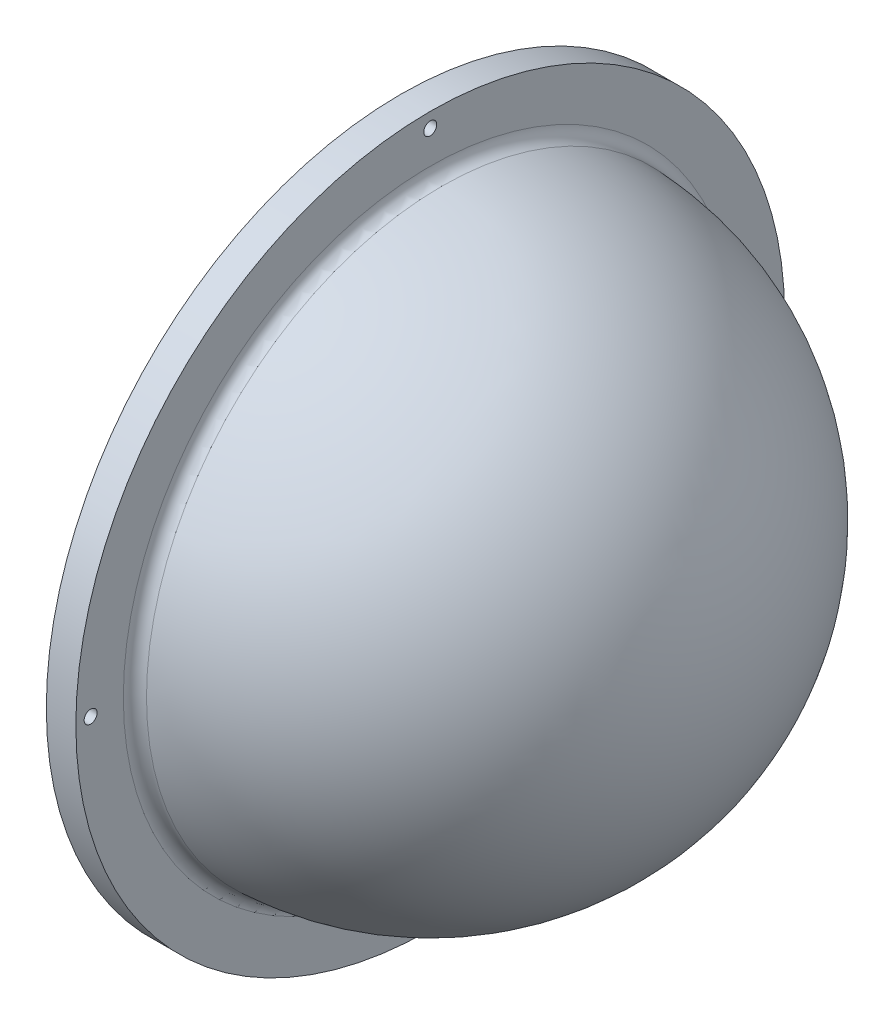
ISO-10303-21;
HEADER;
FILE_DESCRIPTION(('STEP AP214'),'2;1');
FILE_NAME('part.step','',(''),(''),'','','');
FILE_SCHEMA(('AUTOMOTIVE_DESIGN { 1 0 10303 214 1 1 1 1 }'));
ENDSEC;
DATA;
#1=APPLICATION_CONTEXT('core data for automotive mechanical design processes');
#2=APPLICATION_PROTOCOL_DEFINITION('international standard','automotive_design',2000,#1);
#3=PRODUCT_CONTEXT('',#1,'mechanical');
#4=PRODUCT('Part','Part','',(#3));
#5=PRODUCT_RELATED_PRODUCT_CATEGORY('part','',(#4));
#6=PRODUCT_DEFINITION_FORMATION('','',#4);
#7=PRODUCT_DEFINITION_CONTEXT('part definition',#1,'design');
#8=PRODUCT_DEFINITION('design','',#6,#7);
#9=PRODUCT_DEFINITION_SHAPE('','',#8);
#10=(LENGTH_UNIT() NAMED_UNIT(*) SI_UNIT(.MILLI.,.METRE.));
#11=(NAMED_UNIT(*) PLANE_ANGLE_UNIT() SI_UNIT($,.RADIAN.));
#12=(NAMED_UNIT(*) SI_UNIT($,.STERADIAN.) SOLID_ANGLE_UNIT());
#13=UNCERTAINTY_MEASURE_WITH_UNIT(LENGTH_MEASURE(1.E-05),#10,'distance_accuracy_value','');
#14=(GEOMETRIC_REPRESENTATION_CONTEXT(3) GLOBAL_UNCERTAINTY_ASSIGNED_CONTEXT((#13)) GLOBAL_UNIT_ASSIGNED_CONTEXT((#10,
#11,#12)) REPRESENTATION_CONTEXT('',''));
#15=CARTESIAN_POINT('',(0.,0.,0.));
#16=DIRECTION('',(0.,0.,1.));
#17=DIRECTION('',(1.,0.,0.));
#18=AXIS2_PLACEMENT_3D('',#15,#16,#17);
#19=CARTESIAN_POINT('',(0.,76.2,0.));
#20=DIRECTION('',(1.,0.,0.));
#21=DIRECTION('',(0.,0.,-1.));
#22=AXIS2_PLACEMENT_3D('',#19,#20,#21);
#23=PLANE('',#22);
#24=CARTESIAN_POINT('',(0.,-4.15001175601604E-12,73.0249999999959));
#25=DIRECTION('',(1.,0.,0.));
#26=DIRECTION('',(0.,0.,-1.));
#27=AXIS2_PLACEMENT_3D('',#24,#25,#26);
#28=CIRCLE('',#27,1.39515039483345);
#29=CARTESIAN_POINT('',(0.,-4.15001175601604E-12,71.6298496051624));
#30=VERTEX_POINT('',#29);
#31=EDGE_CURVE('E73',#30,#30,#28,.T.);
#32=ORIENTED_EDGE('',*,*,#31,.T.);
#33=EDGE_LOOP('',(#32));
#34=FACE_BOUND('',#33,.T.);
#35=CARTESIAN_POINT('',(0.,-73.025,-8.283116451825E-12));
#36=DIRECTION('',(1.,0.,0.));
#37=DIRECTION('',(0.,0.,-1.));
#38=AXIS2_PLACEMENT_3D('',#35,#36,#37);
#39=CIRCLE('',#38,1.39515039483595);
#40=CARTESIAN_POINT('',(0.,-73.025,-1.39515039484423));
#41=VERTEX_POINT('',#40);
#42=EDGE_CURVE('E67',#41,#41,#39,.T.);
#43=ORIENTED_EDGE('',*,*,#42,.T.);
#44=EDGE_LOOP('',(#43));
#45=FACE_BOUND('',#44,.T.);
#46=CARTESIAN_POINT('',(0.,4.14106877276527E-12,-73.0250000000041));
#47=DIRECTION('',(1.,0.,0.));
#48=DIRECTION('',(0.,0.,-1.));
#49=AXIS2_PLACEMENT_3D('',#46,#47,#48);
#50=CIRCLE('',#49,1.39515039483054);
#51=CARTESIAN_POINT('',(0.,4.14106877276527E-12,-74.4201503948347));
#52=VERTEX_POINT('',#51);
#53=EDGE_CURVE('E61',#52,#52,#50,.T.);
#54=ORIENTED_EDGE('',*,*,#53,.T.);
#55=EDGE_LOOP('',(#54));
#56=FACE_BOUND('',#55,.T.);
#57=CARTESIAN_POINT('',(0.,73.025,0.));
#58=DIRECTION('',(1.,0.,0.));
#59=DIRECTION('',(0.,0.,-1.));
#60=AXIS2_PLACEMENT_3D('',#57,#58,#59);
#61=CIRCLE('',#60,1.39515039482754);
#62=CARTESIAN_POINT('',(0.,73.025,-1.39515039482754));
#63=VERTEX_POINT('',#62);
#64=EDGE_CURVE('E57',#63,#63,#61,.T.);
#65=ORIENTED_EDGE('',*,*,#64,.T.);
#66=EDGE_LOOP('',(#65));
#67=FACE_BOUND('',#66,.T.);
#68=CARTESIAN_POINT('',(0.,0.,0.));
#69=DIRECTION('',(-1.,0.,0.));
#70=DIRECTION('',(0.,0.,1.));
#71=AXIS2_PLACEMENT_3D('',#68,#69,#70);
#72=CIRCLE('',#71,57.15);
#73=CARTESIAN_POINT('',(0.,0.,57.15));
#74=VERTEX_POINT('',#73);
#75=EDGE_CURVE('E42',#74,#74,#72,.T.);
#76=ORIENTED_EDGE('',*,*,#75,.F.);
#77=EDGE_LOOP('',(#76));
#78=FACE_BOUND('',#77,.T.);
#79=CARTESIAN_POINT('',(0.,0.,0.));
#80=DIRECTION('',(-1.,0.,0.));
#81=DIRECTION('',(0.,0.,1.));
#82=AXIS2_PLACEMENT_3D('',#79,#80,#81);
#83=CIRCLE('',#82,76.2);
#84=CARTESIAN_POINT('',(0.,0.,76.2));
#85=VERTEX_POINT('',#84);
#86=EDGE_CURVE('E54',#85,#85,#83,.T.);
#87=ORIENTED_EDGE('',*,*,#86,.T.);
#88=EDGE_LOOP('',(#87));
#89=FACE_BOUND('',#88,.T.);
#90=ADVANCED_FACE('F31',(#34,#45,#56,#67,#78,#89),#23,.F.);
#91=CARTESIAN_POINT('',(0.,0.,0.));
#92=DIRECTION('',(-1.,0.,0.));
#93=DIRECTION('',(0.,0.,1.));
#94=AXIS2_PLACEMENT_3D('',#91,#92,#93);
#95=CYLINDRICAL_SURFACE('',#94,57.15);
#96=CARTESIAN_POINT('',(6.35000000000001,0.,0.));
#97=DIRECTION('',(-1.,0.,0.));
#98=DIRECTION('',(0.,0.,1.));
#99=AXIS2_PLACEMENT_3D('',#96,#97,#98);
#100=CIRCLE('',#99,57.15);
#101=CARTESIAN_POINT('',(6.35000000000001,0.,57.15));
#102=VERTEX_POINT('',#101);
#103=EDGE_CURVE('E46',#102,#102,#100,.T.);
#104=ORIENTED_EDGE('',*,*,#103,.F.);
#105=EDGE_LOOP('',(#104));
#106=FACE_BOUND('',#105,.T.);
#107=ORIENTED_EDGE('',*,*,#75,.T.);
#108=EDGE_LOOP('',(#107));
#109=FACE_BOUND('',#108,.T.);
#110=ADVANCED_FACE('F116',(#106,#109),#95,.F.);
#111=CARTESIAN_POINT('',(6.35,0.,0.));
#112=DIRECTION('',(-1.,0.,0.));
#113=DIRECTION('',(0.,1.,0.));
#114=AXIS2_PLACEMENT_3D('',#111,#112,#113);
#115=SPHERICAL_SURFACE('',#114,57.15);
#116=ORIENTED_EDGE('',*,*,#103,.T.);
#117=EDGE_LOOP('',(#116));
#118=FACE_BOUND('',#117,.T.);
#119=ADVANCED_FACE('F120',(#118),#115,.F.);
#120=CARTESIAN_POINT('',(6.35,0.,0.));
#121=DIRECTION('',(-1.,0.,0.));
#122=DIRECTION('',(0.,1.,0.));
#123=AXIS2_PLACEMENT_3D('',#120,#121,#122);
#124=SPHERICAL_SURFACE('',#123,63.5);
#125=CARTESIAN_POINT('',(8.79230769230769,0.,0.));
#126=DIRECTION('',(-1.,0.,0.));
#127=DIRECTION('',(0.,0.,1.));
#128=AXIS2_PLACEMENT_3D('',#125,#126,#127);
#129=CIRCLE('',#128,63.4530151618983);
#130=CARTESIAN_POINT('',(8.79230769230769,0.,63.4530151618983));
#131=VERTEX_POINT('',#130);
#132=EDGE_CURVE('E10',#131,#131,#129,.F.);
#133=ORIENTED_EDGE('',*,*,#132,.T.);
#134=EDGE_LOOP('',(#133));
#135=FACE_BOUND('',#134,.T.);
#136=ADVANCED_FACE('F95',(#135),#124,.T.);
#137=CARTESIAN_POINT('',(6.35,76.2,0.));
#138=DIRECTION('',(-1.,0.,0.));
#139=DIRECTION('',(0.,0.,1.));
#140=AXIS2_PLACEMENT_3D('',#137,#138,#139);
#141=PLANE('',#140);
#142=CARTESIAN_POINT('',(6.35,-4.15001175601604E-12,73.0249999999959));
#143=DIRECTION('',(1.,0.,0.));
#144=DIRECTION('',(0.,0.,-1.));
#145=AXIS2_PLACEMENT_3D('',#142,#143,#144);
#146=CIRCLE('',#145,1.39515039483345);
#147=CARTESIAN_POINT('',(6.35,-4.15001175601604E-12,71.6298496051624));
#148=VERTEX_POINT('',#147);
#149=EDGE_CURVE('E76',#148,#148,#146,.T.);
#150=ORIENTED_EDGE('',*,*,#149,.F.);
#151=EDGE_LOOP('',(#150));
#152=FACE_BOUND('',#151,.T.);
#153=CARTESIAN_POINT('',(6.35,-73.025,-8.283116451825E-12));
#154=DIRECTION('',(1.,0.,0.));
#155=DIRECTION('',(0.,0.,-1.));
#156=AXIS2_PLACEMENT_3D('',#153,#154,#155);
#157=CIRCLE('',#156,1.39515039483595);
#158=CARTESIAN_POINT('',(6.35,-73.025,-1.39515039484423));
#159=VERTEX_POINT('',#158);
#160=EDGE_CURVE('E70',#159,#159,#157,.T.);
#161=ORIENTED_EDGE('',*,*,#160,.F.);
#162=EDGE_LOOP('',(#161));
#163=FACE_BOUND('',#162,.T.);
#164=CARTESIAN_POINT('',(6.35,4.14106877276527E-12,-73.0250000000041));
#165=DIRECTION('',(1.,0.,0.));
#166=DIRECTION('',(0.,0.,-1.));
#167=AXIS2_PLACEMENT_3D('',#164,#165,#166);
#168=CIRCLE('',#167,1.39515039483054);
#169=CARTESIAN_POINT('',(6.35,4.14106877276527E-12,-74.4201503948347));
#170=VERTEX_POINT('',#169);
#171=EDGE_CURVE('E64',#170,#170,#168,.T.);
#172=ORIENTED_EDGE('',*,*,#171,.F.);
#173=EDGE_LOOP('',(#172));
#174=FACE_BOUND('',#173,.T.);
#175=CARTESIAN_POINT('',(6.35,73.025,0.));
#176=DIRECTION('',(1.,0.,0.));
#177=DIRECTION('',(0.,0.,-1.));
#178=AXIS2_PLACEMENT_3D('',#175,#176,#177);
#179=CIRCLE('',#178,1.39515039482754);
#180=CARTESIAN_POINT('',(6.35,73.025,-1.39515039482754));
#181=VERTEX_POINT('',#180);
#182=EDGE_CURVE('E58',#181,#181,#179,.T.);
#183=ORIENTED_EDGE('',*,*,#182,.F.);
#184=EDGE_LOOP('',(#183));
#185=FACE_BOUND('',#184,.T.);
#186=CARTESIAN_POINT('',(6.35,0.,0.));
#187=DIRECTION('',(-1.,0.,0.));
#188=DIRECTION('',(0.,0.,1.));
#189=AXIS2_PLACEMENT_3D('',#186,#187,#188);
#190=CIRCLE('',#189,65.9911357683742);
#191=CARTESIAN_POINT('',(6.35,0.,65.9911357683742));
#192=VERTEX_POINT('',#191);
#193=EDGE_CURVE('E38',#192,#192,#190,.T.);
#194=ORIENTED_EDGE('',*,*,#193,.T.);
#195=EDGE_LOOP('',(#194));
#196=FACE_BOUND('',#195,.T.);
#197=CARTESIAN_POINT('',(6.35,0.,0.));
#198=DIRECTION('',(-1.,0.,0.));
#199=DIRECTION('',(0.,0.,1.));
#200=AXIS2_PLACEMENT_3D('',#197,#198,#199);
#201=CIRCLE('',#200,76.2);
#202=CARTESIAN_POINT('',(6.35,0.,76.2));
#203=VERTEX_POINT('',#202);
#204=EDGE_CURVE('E51',#203,#203,#201,.T.);
#205=ORIENTED_EDGE('',*,*,#204,.F.);
#206=EDGE_LOOP('',(#205));
#207=FACE_BOUND('',#206,.T.);
#208=ADVANCED_FACE('F91',(#152,#163,#174,#185,#196,#207),#141,.F.);
#209=CARTESIAN_POINT('',(0.,0.,0.));
#210=DIRECTION('',(-1.,0.,0.));
#211=DIRECTION('',(0.,0.,1.));
#212=AXIS2_PLACEMENT_3D('',#209,#210,#211);
#213=CYLINDRICAL_SURFACE('',#212,76.2);
#214=ORIENTED_EDGE('',*,*,#86,.F.);
#215=EDGE_LOOP('',(#214));
#216=FACE_BOUND('',#215,.T.);
#217=ORIENTED_EDGE('',*,*,#204,.T.);
#218=EDGE_LOOP('',(#217));
#219=FACE_BOUND('',#218,.T.);
#220=ADVANCED_FACE('F94',(#216,#219),#213,.T.);
#221=CARTESIAN_POINT('',(8.89,0.,0.));
#222=DIRECTION('',(-1.,0.,0.));
#223=DIRECTION('',(0.,0.,1.));
#224=AXIS2_PLACEMENT_3D('',#221,#222,#223);
#225=TOROIDAL_SURFACE('',#224,65.9911357683742,2.54);
#226=ORIENTED_EDGE('',*,*,#132,.F.);
#227=EDGE_LOOP('',(#226));
#228=FACE_BOUND('',#227,.T.);
#229=ORIENTED_EDGE('',*,*,#193,.F.);
#230=EDGE_LOOP('',(#229));
#231=FACE_BOUND('',#230,.T.);
#232=ADVANCED_FACE('F33',(#228,#231),#225,.F.);
#233=CARTESIAN_POINT('',(0.,73.025,0.));
#234=DIRECTION('',(1.,0.,0.));
#235=DIRECTION('',(0.,0.,-1.));
#236=AXIS2_PLACEMENT_3D('',#233,#234,#235);
#237=CYLINDRICAL_SURFACE('',#236,1.39515039482754);
#238=ORIENTED_EDGE('',*,*,#64,.F.);
#239=EDGE_LOOP('',(#238));
#240=FACE_BOUND('',#239,.T.);
#241=ORIENTED_EDGE('',*,*,#182,.T.);
#242=EDGE_LOOP('',(#241));
#243=FACE_BOUND('',#242,.T.);
#244=ADVANCED_FACE('F111',(#240,#243),#237,.F.);
#245=CARTESIAN_POINT('',(0.,4.14106877276527E-12,-73.0250000000041));
#246=DIRECTION('',(1.,0.,0.));
#247=DIRECTION('',(0.,0.,-1.));
#248=AXIS2_PLACEMENT_3D('',#245,#246,#247);
#249=CYLINDRICAL_SURFACE('',#248,1.39515039483054);
#250=ORIENTED_EDGE('',*,*,#53,.F.);
#251=EDGE_LOOP('',(#250));
#252=FACE_BOUND('',#251,.T.);
#253=ORIENTED_EDGE('',*,*,#171,.T.);
#254=EDGE_LOOP('',(#253));
#255=FACE_BOUND('',#254,.T.);
#256=ADVANCED_FACE('F149',(#252,#255),#249,.F.);
#257=CARTESIAN_POINT('',(0.,-73.025,-8.283116451825E-12));
#258=DIRECTION('',(1.,0.,0.));
#259=DIRECTION('',(0.,0.,-1.));
#260=AXIS2_PLACEMENT_3D('',#257,#258,#259);
#261=CYLINDRICAL_SURFACE('',#260,1.39515039483595);
#262=ORIENTED_EDGE('',*,*,#42,.F.);
#263=EDGE_LOOP('',(#262));
#264=FACE_BOUND('',#263,.T.);
#265=ORIENTED_EDGE('',*,*,#160,.T.);
#266=EDGE_LOOP('',(#265));
#267=FACE_BOUND('',#266,.T.);
#268=ADVANCED_FACE('F87',(#264,#267),#261,.F.);
#269=CARTESIAN_POINT('',(0.,-4.15001175601604E-12,73.0249999999959));
#270=DIRECTION('',(1.,0.,0.));
#271=DIRECTION('',(0.,0.,-1.));
#272=AXIS2_PLACEMENT_3D('',#269,#270,#271);
#273=CYLINDRICAL_SURFACE('',#272,1.39515039483345);
#274=ORIENTED_EDGE('',*,*,#31,.F.);
#275=EDGE_LOOP('',(#274));
#276=FACE_BOUND('',#275,.T.);
#277=ORIENTED_EDGE('',*,*,#149,.T.);
#278=EDGE_LOOP('',(#277));
#279=FACE_BOUND('',#278,.T.);
#280=ADVANCED_FACE('F84',(#276,#279),#273,.F.);
#281=CLOSED_SHELL('',(#90,#110,#119,#136,#208,#220,#232,#244,#256,#268,#280));
#282=MANIFOLD_SOLID_BREP('B2',#281);
#283=ADVANCED_BREP_SHAPE_REPRESENTATION('',(#18,#282),#14);
#284=SHAPE_DEFINITION_REPRESENTATION(#9,#283);
ENDSEC;
END-ISO-10303-21;
